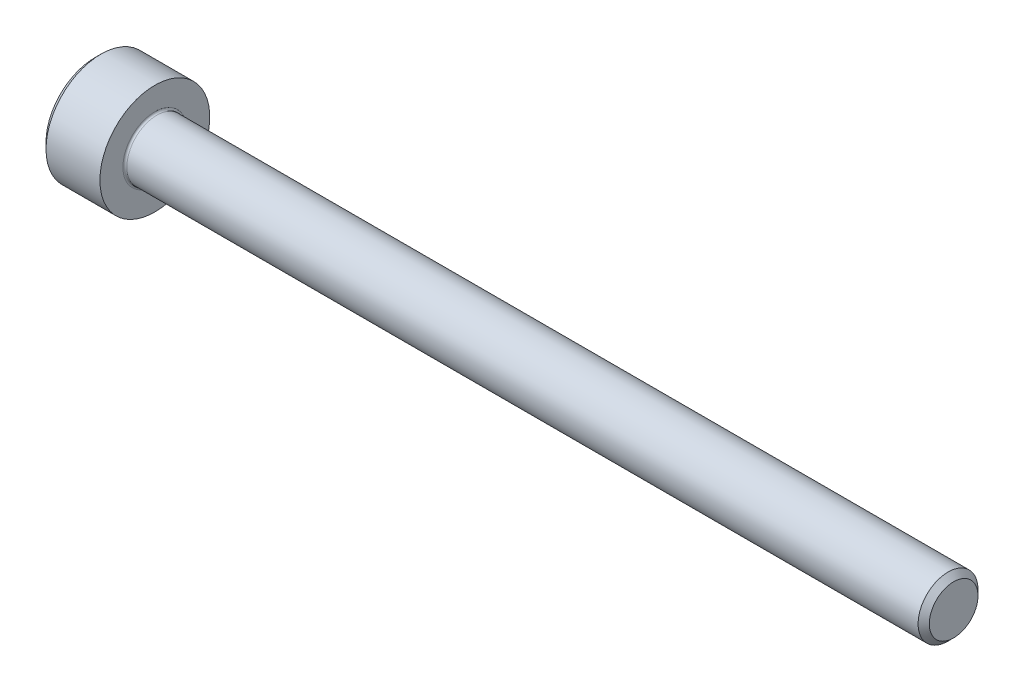
ISO-10303-21;
HEADER;
FILE_DESCRIPTION(('STEP AP214'),'2;1');
FILE_NAME('part.step','',(''),(''),'','','');
FILE_SCHEMA(('AUTOMOTIVE_DESIGN { 1 0 10303 214 1 1 1 1 }'));
ENDSEC;
DATA;
#1=APPLICATION_CONTEXT('core data for automotive mechanical design processes');
#2=APPLICATION_PROTOCOL_DEFINITION('international standard','automotive_design',2000,#1);
#3=PRODUCT_CONTEXT('',#1,'mechanical');
#4=PRODUCT('Part','Part','',(#3));
#5=PRODUCT_RELATED_PRODUCT_CATEGORY('part','',(#4));
#6=PRODUCT_DEFINITION_FORMATION('','',#4);
#7=PRODUCT_DEFINITION_CONTEXT('part definition',#1,'design');
#8=PRODUCT_DEFINITION('design','',#6,#7);
#9=PRODUCT_DEFINITION_SHAPE('','',#8);
#10=(LENGTH_UNIT() NAMED_UNIT(*) SI_UNIT(.MILLI.,.METRE.));
#11=(NAMED_UNIT(*) PLANE_ANGLE_UNIT() SI_UNIT($,.RADIAN.));
#12=(NAMED_UNIT(*) SI_UNIT($,.STERADIAN.) SOLID_ANGLE_UNIT());
#13=UNCERTAINTY_MEASURE_WITH_UNIT(LENGTH_MEASURE(1.E-05),#10,'distance_accuracy_value','');
#14=(GEOMETRIC_REPRESENTATION_CONTEXT(3) GLOBAL_UNCERTAINTY_ASSIGNED_CONTEXT((#13)) GLOBAL_UNIT_ASSIGNED_CONTEXT((#10,
#11,#12)) REPRESENTATION_CONTEXT('',''));
#15=CARTESIAN_POINT('',(0.,0.,0.));
#16=DIRECTION('',(0.,0.,1.));
#17=DIRECTION('',(1.,0.,0.));
#18=AXIS2_PLACEMENT_3D('',#15,#16,#17);
#19=CARTESIAN_POINT('',(0.,0.,0.));
#20=DIRECTION('',(-1.,0.,0.));
#21=DIRECTION('',(0.,0.,1.));
#22=AXIS2_PLACEMENT_3D('',#19,#20,#21);
#23=PLANE('',#22);
#24=DIRECTION('',(0.,-0.499999999999998,0.86602540378444));
#25=VECTOR('',#24,1.);
#26=CARTESIAN_POINT('',(0.,1.47801668912544,0.));
#27=LINE('',#26,#25);
#28=CARTESIAN_POINT('',(0.,1.47801668912544,0.));
#29=VERTEX_POINT('',#28);
#30=CARTESIAN_POINT('',(0.,0.739008344562719,1.28));
#31=VERTEX_POINT('',#30);
#32=EDGE_CURVE('E391',#29,#31,#27,.T.);
#33=ORIENTED_EDGE('',*,*,#32,.T.);
#34=DIRECTION('',(0.,1.,0.));
#35=VECTOR('',#34,1.);
#36=CARTESIAN_POINT('',(0.,-0.739008344562723,1.28));
#37=LINE('',#36,#35);
#38=CARTESIAN_POINT('',(0.,-0.739008344562723,1.28));
#39=VERTEX_POINT('',#38);
#40=EDGE_CURVE('E127',#39,#31,#37,.T.);
#41=ORIENTED_EDGE('',*,*,#40,.F.);
#42=DIRECTION('',(0.,-0.500000000000001,-0.866025403784438));
#43=VECTOR('',#42,1.);
#44=CARTESIAN_POINT('',(0.,-0.739008344562723,1.28));
#45=LINE('',#44,#43);
#46=CARTESIAN_POINT('',(0.,-1.47801668912545,0.));
#47=VERTEX_POINT('',#46);
#48=EDGE_CURVE('E394',#39,#47,#45,.T.);
#49=ORIENTED_EDGE('',*,*,#48,.T.);
#50=DIRECTION('',(0.,0.499999999999998,-0.86602540378444));
#51=VECTOR('',#50,1.);
#52=CARTESIAN_POINT('',(0.,-1.47801668912545,0.));
#53=LINE('',#52,#51);
#54=CARTESIAN_POINT('',(0.,-0.739008344562727,-1.28));
#55=VERTEX_POINT('',#54);
#56=EDGE_CURVE('E397',#47,#55,#53,.T.);
#57=ORIENTED_EDGE('',*,*,#56,.T.);
#58=DIRECTION('',(0.,-1.,0.));
#59=VECTOR('',#58,1.);
#60=CARTESIAN_POINT('',(0.,0.739008344562715,-1.28));
#61=LINE('',#60,#59);
#62=CARTESIAN_POINT('',(0.,0.739008344562715,-1.28));
#63=VERTEX_POINT('',#62);
#64=EDGE_CURVE('E400',#63,#55,#61,.T.);
#65=ORIENTED_EDGE('',*,*,#64,.F.);
#66=DIRECTION('',(0.,-0.500000000000001,-0.866025403784438));
#67=VECTOR('',#66,1.);
#68=CARTESIAN_POINT('',(0.,1.47801668912544,0.));
#69=LINE('',#68,#67);
#70=EDGE_CURVE('E122',#29,#63,#69,.T.);
#71=ORIENTED_EDGE('',*,*,#70,.F.);
#72=EDGE_LOOP('',(#33,#41,#49,#57,#65,#71));
#73=FACE_BOUND('',#72,.T.);
#74=CARTESIAN_POINT('',(0.,0.,0.));
#75=DIRECTION('',(-1.,0.,0.));
#76=DIRECTION('',(0.,0.,1.));
#77=AXIS2_PLACEMENT_3D('',#74,#75,#76);
#78=CIRCLE('',#77,2.45);
#79=CARTESIAN_POINT('',(0.,0.,2.45));
#80=VERTEX_POINT('',#79);
#81=EDGE_CURVE('E138',#80,#80,#78,.T.);
#82=ORIENTED_EDGE('',*,*,#81,.T.);
#83=EDGE_LOOP('',(#82));
#84=FACE_BOUND('',#83,.T.);
#85=ADVANCED_FACE('F35',(#73,#84),#23,.T.);
#86=CARTESIAN_POINT('',(43.,1.2195,0.));
#87=DIRECTION('',(1.,0.,0.));
#88=DIRECTION('',(0.,0.,-1.));
#89=AXIS2_PLACEMENT_3D('',#86,#87,#88);
#90=PLANE('',#89);
#91=CARTESIAN_POINT('',(43.,0.,0.));
#92=DIRECTION('',(-1.,0.,0.));
#93=DIRECTION('',(0.,0.,1.));
#94=AXIS2_PLACEMENT_3D('',#91,#92,#93);
#95=CIRCLE('',#94,1.2195);
#96=CARTESIAN_POINT('',(43.,0.,1.2195));
#97=VERTEX_POINT('',#96);
#98=EDGE_CURVE('E151',#97,#97,#95,.T.);
#99=ORIENTED_EDGE('',*,*,#98,.F.);
#100=EDGE_LOOP('',(#99));
#101=FACE_BOUND('',#100,.T.);
#102=ADVANCED_FACE('F172',(#101),#90,.T.);
#103=CARTESIAN_POINT('',(43.,0.,0.));
#104=DIRECTION('',(-1.,0.,0.));
#105=DIRECTION('',(0.,0.,1.));
#106=AXIS2_PLACEMENT_3D('',#103,#104,#105);
#107=CONICAL_SURFACE('',#106,1.2195,0.785398163397322);
#108=CARTESIAN_POINT('',(42.7195,0.,0.));
#109=DIRECTION('',(-1.,0.,0.));
#110=DIRECTION('',(0.,0.,1.));
#111=AXIS2_PLACEMENT_3D('',#108,#109,#110);
#112=CIRCLE('',#111,1.49999999999996);
#113=CARTESIAN_POINT('',(42.7195,0.,1.49999999999996));
#114=VERTEX_POINT('',#113);
#115=EDGE_CURVE('E148',#114,#114,#112,.T.);
#116=ORIENTED_EDGE('',*,*,#115,.F.);
#117=EDGE_LOOP('',(#116));
#118=FACE_BOUND('',#117,.T.);
#119=ORIENTED_EDGE('',*,*,#98,.T.);
#120=EDGE_LOOP('',(#119));
#121=FACE_BOUND('',#120,.T.);
#122=ADVANCED_FACE('F178',(#118,#121),#107,.T.);
#123=CARTESIAN_POINT('',(-31.75,0.,0.));
#124=DIRECTION('',(-1.,0.,0.));
#125=DIRECTION('',(0.,0.,1.));
#126=AXIS2_PLACEMENT_3D('',#123,#124,#125);
#127=CYLINDRICAL_SURFACE('',#126,1.49999999999998);
#128=CARTESIAN_POINT('',(3.1,0.,0.));
#129=DIRECTION('',(1.,0.,0.));
#130=DIRECTION('',(0.,0.,-1.));
#131=AXIS2_PLACEMENT_3D('',#128,#129,#130);
#132=CIRCLE('',#131,1.49999999999998);
#133=CARTESIAN_POINT('',(3.1,0.,-1.49999999999998));
#134=VERTEX_POINT('',#133);
#135=EDGE_CURVE('E11',#134,#134,#132,.T.);
#136=ORIENTED_EDGE('',*,*,#135,.T.);
#137=EDGE_LOOP('',(#136));
#138=FACE_BOUND('',#137,.T.);
#139=ORIENTED_EDGE('',*,*,#115,.T.);
#140=EDGE_LOOP('',(#139));
#141=FACE_BOUND('',#140,.T.);
#142=ADVANCED_FACE('F189',(#138,#141),#127,.T.);
#143=CARTESIAN_POINT('',(3.,2.75,0.));
#144=DIRECTION('',(1.,0.,0.));
#145=DIRECTION('',(0.,0.,-1.));
#146=AXIS2_PLACEMENT_3D('',#143,#144,#145);
#147=PLANE('',#146);
#148=CARTESIAN_POINT('',(3.,0.,0.));
#149=DIRECTION('',(1.,0.,0.));
#150=DIRECTION('',(0.,0.,-1.));
#151=AXIS2_PLACEMENT_3D('',#148,#149,#150);
#152=CIRCLE('',#151,1.59999999999998);
#153=CARTESIAN_POINT('',(3.,0.,-1.59999999999998));
#154=VERTEX_POINT('',#153);
#155=EDGE_CURVE('E43',#154,#154,#152,.F.);
#156=ORIENTED_EDGE('',*,*,#155,.T.);
#157=EDGE_LOOP('',(#156));
#158=FACE_BOUND('',#157,.T.);
#159=CARTESIAN_POINT('',(3.,0.,0.));
#160=DIRECTION('',(-1.,0.,0.));
#161=DIRECTION('',(0.,0.,1.));
#162=AXIS2_PLACEMENT_3D('',#159,#160,#161);
#163=CIRCLE('',#162,2.75);
#164=CARTESIAN_POINT('',(3.,0.,2.75));
#165=VERTEX_POINT('',#164);
#166=EDGE_CURVE('E145',#165,#165,#163,.T.);
#167=ORIENTED_EDGE('',*,*,#166,.F.);
#168=EDGE_LOOP('',(#167));
#169=FACE_BOUND('',#168,.T.);
#170=ADVANCED_FACE('F156',(#158,#169),#147,.T.);
#171=CARTESIAN_POINT('',(-31.75,0.,0.));
#172=DIRECTION('',(-1.,0.,0.));
#173=DIRECTION('',(0.,0.,1.));
#174=AXIS2_PLACEMENT_3D('',#171,#172,#173);
#175=CYLINDRICAL_SURFACE('',#174,2.75);
#176=ORIENTED_EDGE('',*,*,#166,.T.);
#177=EDGE_LOOP('',(#176));
#178=FACE_BOUND('',#177,.T.);
#179=CARTESIAN_POINT('',(0.300000000000002,0.,0.));
#180=DIRECTION('',(-1.,0.,0.));
#181=DIRECTION('',(0.,0.,1.));
#182=AXIS2_PLACEMENT_3D('',#179,#180,#181);
#183=CIRCLE('',#182,2.75);
#184=CARTESIAN_POINT('',(0.300000000000002,0.,2.75));
#185=VERTEX_POINT('',#184);
#186=EDGE_CURVE('E142',#185,#185,#183,.T.);
#187=ORIENTED_EDGE('',*,*,#186,.F.);
#188=EDGE_LOOP('',(#187));
#189=FACE_BOUND('',#188,.T.);
#190=ADVANCED_FACE('F167',(#178,#189),#175,.T.);
#191=CARTESIAN_POINT('',(0.,0.,0.));
#192=DIRECTION('',(1.,0.,0.));
#193=DIRECTION('',(0.,0.,-1.));
#194=AXIS2_PLACEMENT_3D('',#191,#192,#193);
#195=CONICAL_SURFACE('',#194,2.45,0.785398163397448);
#196=ORIENTED_EDGE('',*,*,#186,.T.);
#197=EDGE_LOOP('',(#196));
#198=FACE_BOUND('',#197,.T.);
#199=ORIENTED_EDGE('',*,*,#81,.F.);
#200=EDGE_LOOP('',(#199));
#201=FACE_BOUND('',#200,.T.);
#202=ADVANCED_FACE('F160',(#198,#201),#195,.T.);
#203=CARTESIAN_POINT('',(3.1,0.,0.));
#204=DIRECTION('',(1.,0.,0.));
#205=DIRECTION('',(0.,0.,-1.));
#206=AXIS2_PLACEMENT_3D('',#203,#204,#205);
#207=TOROIDAL_SURFACE('',#206,1.59999999999998,0.1);
#208=ORIENTED_EDGE('',*,*,#135,.F.);
#209=EDGE_LOOP('',(#208));
#210=FACE_BOUND('',#209,.T.);
#211=ORIENTED_EDGE('',*,*,#155,.F.);
#212=EDGE_LOOP('',(#211));
#213=FACE_BOUND('',#212,.T.);
#214=ADVANCED_FACE('F37',(#210,#213),#207,.F.);
#215=CARTESIAN_POINT('',(1.3,1.47801668912544,0.));
#216=DIRECTION('',(0.,-0.86602540378444,-0.499999999999998));
#217=DIRECTION('',(0.,0.499999999999998,-0.86602540378444));
#218=AXIS2_PLACEMENT_3D('',#215,#216,#217);
#219=PLANE('',#218);
#220=ORIENTED_EDGE('',*,*,#32,.F.);
#221=DIRECTION('',(-1.,0.,0.));
#222=VECTOR('',#221,1.);
#223=CARTESIAN_POINT('',(1.3,1.47801668912544,0.));
#224=LINE('',#223,#222);
#225=CARTESIAN_POINT('',(1.3,1.47801668912544,0.));
#226=VERTEX_POINT('',#225);
#227=EDGE_CURVE('E390',#226,#29,#224,.T.);
#228=ORIENTED_EDGE('',*,*,#227,.F.);
#229=DIRECTION('',(0.,-0.499999999999998,0.86602540378444));
#230=VECTOR('',#229,1.);
#231=CARTESIAN_POINT('',(1.3,1.47801668912544,0.));
#232=LINE('',#231,#230);
#233=CARTESIAN_POINT('',(1.3,1.10851251684408,0.639999999999998));
#234=VERTEX_POINT('',#233);
#235=EDGE_CURVE('E50',#226,#234,#232,.T.);
#236=ORIENTED_EDGE('',*,*,#235,.T.);
#237=CARTESIAN_POINT('',(1.3,0.739008344562719,1.28));
#238=VERTEX_POINT('',#237);
#239=EDGE_CURVE('E108',#234,#238,#232,.T.);
#240=ORIENTED_EDGE('',*,*,#239,.T.);
#241=DIRECTION('',(-1.,0.,0.));
#242=VECTOR('',#241,1.);
#243=CARTESIAN_POINT('',(1.3,0.739008344562719,1.28));
#244=LINE('',#243,#242);
#245=EDGE_CURVE('E120',#238,#31,#244,.T.);
#246=ORIENTED_EDGE('',*,*,#245,.T.);
#247=EDGE_LOOP('',(#220,#228,#236,#240,#246));
#248=FACE_BOUND('',#247,.T.);
#249=ADVANCED_FACE('F119',(#248),#219,.T.);
#250=CARTESIAN_POINT('',(1.3,-0.739008344562723,1.28));
#251=DIRECTION('',(0.,0.,1.));
#252=DIRECTION('',(0.,-1.,0.));
#253=AXIS2_PLACEMENT_3D('',#250,#251,#252);
#254=PLANE('',#253);
#255=ORIENTED_EDGE('',*,*,#40,.T.);
#256=ORIENTED_EDGE('',*,*,#245,.F.);
#257=DIRECTION('',(0.,1.,0.));
#258=VECTOR('',#257,1.);
#259=CARTESIAN_POINT('',(1.3,-0.739008344562723,1.28));
#260=LINE('',#259,#258);
#261=CARTESIAN_POINT('',(1.3,0.,1.28));
#262=VERTEX_POINT('',#261);
#263=EDGE_CURVE('E106',#262,#238,#260,.T.);
#264=ORIENTED_EDGE('',*,*,#263,.F.);
#265=CARTESIAN_POINT('',(1.3,-0.739008344562723,1.28));
#266=VERTEX_POINT('',#265);
#267=EDGE_CURVE('E116',#266,#262,#260,.T.);
#268=ORIENTED_EDGE('',*,*,#267,.F.);
#269=DIRECTION('',(-1.,0.,0.));
#270=VECTOR('',#269,1.);
#271=CARTESIAN_POINT('',(1.3,-0.739008344562723,1.28));
#272=LINE('',#271,#270);
#273=EDGE_CURVE('E129',#266,#39,#272,.T.);
#274=ORIENTED_EDGE('',*,*,#273,.T.);
#275=EDGE_LOOP('',(#255,#256,#264,#268,#274));
#276=FACE_BOUND('',#275,.T.);
#277=ADVANCED_FACE('F124',(#276),#254,.F.);
#278=CARTESIAN_POINT('',(1.3,-0.739008344562723,1.28));
#279=DIRECTION('',(0.,0.866025403784438,-0.500000000000001));
#280=DIRECTION('',(0.,0.500000000000001,0.866025403784438));
#281=AXIS2_PLACEMENT_3D('',#278,#279,#280);
#282=PLANE('',#281);
#283=ORIENTED_EDGE('',*,*,#48,.F.);
#284=ORIENTED_EDGE('',*,*,#273,.F.);
#285=DIRECTION('',(0.,-0.500000000000001,-0.866025403784438));
#286=VECTOR('',#285,1.);
#287=CARTESIAN_POINT('',(1.3,-0.739008344562723,1.28));
#288=LINE('',#287,#286);
#289=CARTESIAN_POINT('',(1.3,-1.10851251684408,0.640000000000003));
#290=VERTEX_POINT('',#289);
#291=EDGE_CURVE('E371',#266,#290,#288,.T.);
#292=ORIENTED_EDGE('',*,*,#291,.T.);
#293=CARTESIAN_POINT('',(1.3,-1.47801668912545,0.));
#294=VERTEX_POINT('',#293);
#295=EDGE_CURVE('E373',#290,#294,#288,.T.);
#296=ORIENTED_EDGE('',*,*,#295,.T.);
#297=DIRECTION('',(-1.,0.,0.));
#298=VECTOR('',#297,1.);
#299=CARTESIAN_POINT('',(1.3,-1.47801668912545,0.));
#300=LINE('',#299,#298);
#301=EDGE_CURVE('E134',#294,#47,#300,.T.);
#302=ORIENTED_EDGE('',*,*,#301,.T.);
#303=EDGE_LOOP('',(#283,#284,#292,#296,#302));
#304=FACE_BOUND('',#303,.T.);
#305=ADVANCED_FACE('F263',(#304),#282,.T.);
#306=CARTESIAN_POINT('',(1.3,-1.47801668912545,0.));
#307=DIRECTION('',(0.,0.86602540378444,0.499999999999998));
#308=DIRECTION('',(0.,-0.499999999999998,0.86602540378444));
#309=AXIS2_PLACEMENT_3D('',#306,#307,#308);
#310=PLANE('',#309);
#311=ORIENTED_EDGE('',*,*,#56,.F.);
#312=ORIENTED_EDGE('',*,*,#301,.F.);
#313=DIRECTION('',(0.,0.499999999999998,-0.86602540378444));
#314=VECTOR('',#313,1.);
#315=CARTESIAN_POINT('',(1.3,-1.47801668912545,0.));
#316=LINE('',#315,#314);
#317=CARTESIAN_POINT('',(1.3,-1.10851251684409,-0.639999999999999));
#318=VERTEX_POINT('',#317);
#319=EDGE_CURVE('E376',#294,#318,#316,.T.);
#320=ORIENTED_EDGE('',*,*,#319,.T.);
#321=CARTESIAN_POINT('',(1.3,-0.739008344562727,-1.28));
#322=VERTEX_POINT('',#321);
#323=EDGE_CURVE('E380',#318,#322,#316,.T.);
#324=ORIENTED_EDGE('',*,*,#323,.T.);
#325=DIRECTION('',(-1.,0.,0.));
#326=VECTOR('',#325,1.);
#327=CARTESIAN_POINT('',(1.3,-0.739008344562727,-1.28));
#328=LINE('',#327,#326);
#329=EDGE_CURVE('E409',#322,#55,#328,.T.);
#330=ORIENTED_EDGE('',*,*,#329,.T.);
#331=EDGE_LOOP('',(#311,#312,#320,#324,#330));
#332=FACE_BOUND('',#331,.T.);
#333=ADVANCED_FACE('F271',(#332),#310,.T.);
#334=CARTESIAN_POINT('',(1.3,0.739008344562715,-1.28));
#335=DIRECTION('',(0.,0.,-1.));
#336=DIRECTION('',(0.,1.,0.));
#337=AXIS2_PLACEMENT_3D('',#334,#335,#336);
#338=PLANE('',#337);
#339=ORIENTED_EDGE('',*,*,#64,.T.);
#340=ORIENTED_EDGE('',*,*,#329,.F.);
#341=DIRECTION('',(0.,-1.,0.));
#342=VECTOR('',#341,1.);
#343=CARTESIAN_POINT('',(1.3,0.739008344562715,-1.28));
#344=LINE('',#343,#342);
#345=CARTESIAN_POINT('',(1.3,0.,-1.28));
#346=VERTEX_POINT('',#345);
#347=EDGE_CURVE('E384',#346,#322,#344,.T.);
#348=ORIENTED_EDGE('',*,*,#347,.F.);
#349=CARTESIAN_POINT('',(1.3,0.739008344562715,-1.28));
#350=VERTEX_POINT('',#349);
#351=EDGE_CURVE('E385',#350,#346,#344,.T.);
#352=ORIENTED_EDGE('',*,*,#351,.F.);
#353=DIRECTION('',(-1.,0.,0.));
#354=VECTOR('',#353,1.);
#355=CARTESIAN_POINT('',(1.3,0.739008344562715,-1.28));
#356=LINE('',#355,#354);
#357=EDGE_CURVE('E406',#350,#63,#356,.T.);
#358=ORIENTED_EDGE('',*,*,#357,.T.);
#359=EDGE_LOOP('',(#339,#340,#348,#352,#358));
#360=FACE_BOUND('',#359,.T.);
#361=ADVANCED_FACE('F280',(#360),#338,.F.);
#362=CARTESIAN_POINT('',(1.3,1.47801668912544,0.));
#363=DIRECTION('',(0.,0.866025403784438,-0.500000000000001));
#364=DIRECTION('',(0.,0.500000000000001,0.866025403784438));
#365=AXIS2_PLACEMENT_3D('',#362,#363,#364);
#366=PLANE('',#365);
#367=ORIENTED_EDGE('',*,*,#70,.T.);
#368=ORIENTED_EDGE('',*,*,#357,.F.);
#369=DIRECTION('',(0.,-0.500000000000001,-0.866025403784438));
#370=VECTOR('',#369,1.);
#371=CARTESIAN_POINT('',(1.3,1.47801668912544,0.));
#372=LINE('',#371,#370);
#373=CARTESIAN_POINT('',(1.3,1.10851251684408,-0.64));
#374=VERTEX_POINT('',#373);
#375=EDGE_CURVE('E388',#374,#350,#372,.T.);
#376=ORIENTED_EDGE('',*,*,#375,.F.);
#377=EDGE_CURVE('E362',#226,#374,#372,.T.);
#378=ORIENTED_EDGE('',*,*,#377,.F.);
#379=ORIENTED_EDGE('',*,*,#227,.T.);
#380=EDGE_LOOP('',(#367,#368,#376,#378,#379));
#381=FACE_BOUND('',#380,.T.);
#382=ADVANCED_FACE('F289',(#381),#366,.F.);
#383=CARTESIAN_POINT('',(1.3,0.73900834456272,1.28));
#384=DIRECTION('',(-1.,0.,0.));
#385=DIRECTION('',(0.,0.,1.));
#386=AXIS2_PLACEMENT_3D('',#383,#384,#385);
#387=PLANE('',#386);
#388=CARTESIAN_POINT('',(1.3,0.,0.));
#389=DIRECTION('',(-1.,0.,0.));
#390=DIRECTION('',(0.,0.,1.));
#391=AXIS2_PLACEMENT_3D('',#388,#389,#390);
#392=CIRCLE('',#391,1.28);
#393=EDGE_CURVE('E128',#290,#262,#392,.T.);
#394=ORIENTED_EDGE('',*,*,#393,.F.);
#395=ORIENTED_EDGE('',*,*,#291,.F.);
#396=ORIENTED_EDGE('',*,*,#267,.T.);
#397=EDGE_LOOP('',(#394,#395,#396));
#398=FACE_BOUND('',#397,.T.);
#399=ADVANCED_FACE('F298',(#398),#387,.T.);
#400=EDGE_CURVE('E132',#318,#290,#392,.T.);
#401=ORIENTED_EDGE('',*,*,#400,.F.);
#402=ORIENTED_EDGE('',*,*,#319,.F.);
#403=ORIENTED_EDGE('',*,*,#295,.F.);
#404=EDGE_LOOP('',(#401,#402,#403));
#405=FACE_BOUND('',#404,.T.);
#406=ADVANCED_FACE('F307',(#405),#387,.T.);
#407=EDGE_CURVE('E415',#346,#318,#392,.T.);
#408=ORIENTED_EDGE('',*,*,#407,.F.);
#409=ORIENTED_EDGE('',*,*,#347,.T.);
#410=ORIENTED_EDGE('',*,*,#323,.F.);
#411=EDGE_LOOP('',(#408,#409,#410));
#412=FACE_BOUND('',#411,.T.);
#413=ADVANCED_FACE('F316',(#412),#387,.T.);
#414=EDGE_CURVE('E365',#374,#346,#392,.T.);
#415=ORIENTED_EDGE('',*,*,#414,.F.);
#416=ORIENTED_EDGE('',*,*,#375,.T.);
#417=ORIENTED_EDGE('',*,*,#351,.T.);
#418=EDGE_LOOP('',(#415,#416,#417));
#419=FACE_BOUND('',#418,.T.);
#420=ADVANCED_FACE('F324',(#419),#387,.T.);
#421=EDGE_CURVE('E139',#234,#374,#392,.T.);
#422=ORIENTED_EDGE('',*,*,#421,.F.);
#423=ORIENTED_EDGE('',*,*,#235,.F.);
#424=ORIENTED_EDGE('',*,*,#377,.T.);
#425=EDGE_LOOP('',(#422,#423,#424));
#426=FACE_BOUND('',#425,.T.);
#427=ADVANCED_FACE('F332',(#426),#387,.T.);
#428=EDGE_CURVE('E111',#262,#234,#392,.T.);
#429=ORIENTED_EDGE('',*,*,#428,.F.);
#430=ORIENTED_EDGE('',*,*,#263,.T.);
#431=ORIENTED_EDGE('',*,*,#239,.F.);
#432=EDGE_LOOP('',(#429,#430,#431));
#433=FACE_BOUND('',#432,.T.);
#434=ADVANCED_FACE('F107',(#433),#387,.T.);
#435=CARTESIAN_POINT('',(1.3,0.,0.));
#436=DIRECTION('',(-1.,0.,0.));
#437=DIRECTION('',(0.,0.,1.));
#438=AXIS2_PLACEMENT_3D('',#435,#436,#437);
#439=CONICAL_SURFACE('',#438,1.28,1.0471975511966);
#440=CARTESIAN_POINT('',(2.03900834456273,0.,0.));
#441=VERTEX_POINT('',#440);
#442=VERTEX_LOOP('',#441);
#443=FACE_BOUND('',#442,.T.);
#444=ORIENTED_EDGE('',*,*,#428,.T.);
#445=ORIENTED_EDGE('',*,*,#421,.T.);
#446=ORIENTED_EDGE('',*,*,#414,.T.);
#447=ORIENTED_EDGE('',*,*,#407,.T.);
#448=ORIENTED_EDGE('',*,*,#400,.T.);
#449=ORIENTED_EDGE('',*,*,#393,.T.);
#450=EDGE_LOOP('',(#444,#445,#446,#447,#448,#449));
#451=FACE_BOUND('',#450,.T.);
#452=ADVANCED_FACE('F182',(#443,#451),#439,.F.);
#453=CLOSED_SHELL('',(#85,#102,#122,#142,#170,#190,#202,#214,#249,#277,#305,#333,#361,#382,#399,
#406,#413,#420,#427,#434,#452));
#454=MANIFOLD_SOLID_BREP('B2',#453);
#455=ADVANCED_BREP_SHAPE_REPRESENTATION('',(#18,#454),#14);
#456=SHAPE_DEFINITION_REPRESENTATION(#9,#455);
ENDSEC;
END-ISO-10303-21;
